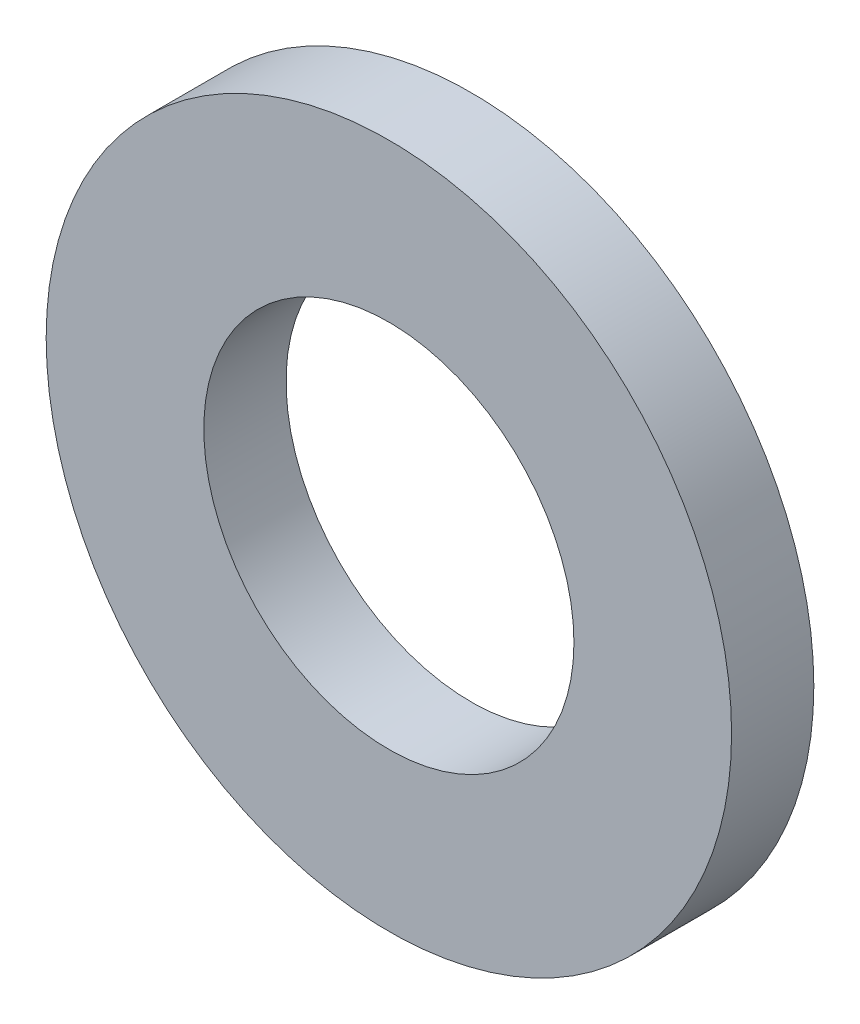
ISO-10303-21;
HEADER;
FILE_DESCRIPTION(('STEP AP214'),'2;1');
FILE_NAME('part.step','',(''),(''),'','','');
FILE_SCHEMA(('AUTOMOTIVE_DESIGN { 1 0 10303 214 1 1 1 1 }'));
ENDSEC;
DATA;
#1=APPLICATION_CONTEXT('core data for automotive mechanical design processes');
#2=APPLICATION_PROTOCOL_DEFINITION('international standard','automotive_design',2000,#1);
#3=PRODUCT_CONTEXT('',#1,'mechanical');
#4=PRODUCT('Part','Part','',(#3));
#5=PRODUCT_RELATED_PRODUCT_CATEGORY('part','',(#4));
#6=PRODUCT_DEFINITION_FORMATION('','',#4);
#7=PRODUCT_DEFINITION_CONTEXT('part definition',#1,'design');
#8=PRODUCT_DEFINITION('design','',#6,#7);
#9=PRODUCT_DEFINITION_SHAPE('','',#8);
#10=(LENGTH_UNIT() NAMED_UNIT(*) SI_UNIT(.MILLI.,.METRE.));
#11=(NAMED_UNIT(*) PLANE_ANGLE_UNIT() SI_UNIT($,.RADIAN.));
#12=(NAMED_UNIT(*) SI_UNIT($,.STERADIAN.) SOLID_ANGLE_UNIT());
#13=UNCERTAINTY_MEASURE_WITH_UNIT(LENGTH_MEASURE(1.E-05),#10,'distance_accuracy_value','');
#14=(GEOMETRIC_REPRESENTATION_CONTEXT(3) GLOBAL_UNCERTAINTY_ASSIGNED_CONTEXT((#13)) GLOBAL_UNIT_ASSIGNED_CONTEXT((#10,
#11,#12)) REPRESENTATION_CONTEXT('',''));
#15=CARTESIAN_POINT('',(0.,0.,0.));
#16=DIRECTION('',(0.,0.,1.));
#17=DIRECTION('',(1.,0.,0.));
#18=AXIS2_PLACEMENT_3D('',#15,#16,#17);
#19=CARTESIAN_POINT('',(0.,0.,0.6));
#20=DIRECTION('',(0.,0.,1.));
#21=DIRECTION('',(1.,0.,0.));
#22=AXIS2_PLACEMENT_3D('',#19,#20,#21);
#23=PLANE('',#22);
#24=CARTESIAN_POINT('',(0.,0.,0.6));
#25=DIRECTION('',(0.,0.,1.));
#26=DIRECTION('',(1.,0.,0.));
#27=AXIS2_PLACEMENT_3D('',#24,#25,#26);
#28=CIRCLE('',#27,2.5);
#29=CARTESIAN_POINT('',(2.5,0.,0.6));
#30=VERTEX_POINT('',#29);
#31=EDGE_CURVE('E10',#30,#30,#28,.T.);
#32=ORIENTED_EDGE('',*,*,#31,.T.);
#33=EDGE_LOOP('',(#32));
#34=FACE_BOUND('',#33,.T.);
#35=CARTESIAN_POINT('',(0.,0.,0.6));
#36=DIRECTION('',(0.,0.,1.));
#37=DIRECTION('',(1.,0.,0.));
#38=AXIS2_PLACEMENT_3D('',#35,#36,#37);
#39=CIRCLE('',#38,1.35);
#40=CARTESIAN_POINT('',(1.35,0.,0.6));
#41=VERTEX_POINT('',#40);
#42=EDGE_CURVE('E41',#41,#41,#39,.T.);
#43=ORIENTED_EDGE('',*,*,#42,.F.);
#44=EDGE_LOOP('',(#43));
#45=FACE_BOUND('',#44,.T.);
#46=ADVANCED_FACE('F30',(#34,#45),#23,.T.);
#47=CARTESIAN_POINT('',(0.,0.,0.));
#48=DIRECTION('',(0.,0.,1.));
#49=DIRECTION('',(1.,0.,0.));
#50=AXIS2_PLACEMENT_3D('',#47,#48,#49);
#51=PLANE('',#50);
#52=CARTESIAN_POINT('',(0.,0.,0.));
#53=DIRECTION('',(0.,0.,1.));
#54=DIRECTION('',(1.,0.,0.));
#55=AXIS2_PLACEMENT_3D('',#52,#53,#54);
#56=CIRCLE('',#55,2.5);
#57=CARTESIAN_POINT('',(2.5,0.,0.));
#58=VERTEX_POINT('',#57);
#59=EDGE_CURVE('E34',#58,#58,#56,.T.);
#60=ORIENTED_EDGE('',*,*,#59,.F.);
#61=EDGE_LOOP('',(#60));
#62=FACE_BOUND('',#61,.T.);
#63=CARTESIAN_POINT('',(0.,0.,0.));
#64=DIRECTION('',(0.,0.,1.));
#65=DIRECTION('',(1.,0.,0.));
#66=AXIS2_PLACEMENT_3D('',#63,#64,#65);
#67=CIRCLE('',#66,1.35);
#68=CARTESIAN_POINT('',(1.35,0.,0.));
#69=VERTEX_POINT('',#68);
#70=EDGE_CURVE('E43',#69,#69,#67,.T.);
#71=ORIENTED_EDGE('',*,*,#70,.T.);
#72=EDGE_LOOP('',(#71));
#73=FACE_BOUND('',#72,.T.);
#74=ADVANCED_FACE('F53',(#62,#73),#51,.F.);
#75=CARTESIAN_POINT('',(0.,0.,0.6));
#76=DIRECTION('',(0.,0.,-1.));
#77=DIRECTION('',(-1.,0.,0.));
#78=AXIS2_PLACEMENT_3D('',#75,#76,#77);
#79=CYLINDRICAL_SURFACE('',#78,2.5);
#80=ORIENTED_EDGE('',*,*,#31,.F.);
#81=EDGE_LOOP('',(#80));
#82=FACE_BOUND('',#81,.T.);
#83=ORIENTED_EDGE('',*,*,#59,.T.);
#84=EDGE_LOOP('',(#83));
#85=FACE_BOUND('',#84,.T.);
#86=ADVANCED_FACE('F32',(#82,#85),#79,.T.);
#87=CARTESIAN_POINT('',(0.,0.,0.6));
#88=DIRECTION('',(0.,0.,-1.));
#89=DIRECTION('',(-1.,0.,0.));
#90=AXIS2_PLACEMENT_3D('',#87,#88,#89);
#91=CYLINDRICAL_SURFACE('',#90,1.35);
#92=ORIENTED_EDGE('',*,*,#42,.T.);
#93=EDGE_LOOP('',(#92));
#94=FACE_BOUND('',#93,.T.);
#95=ORIENTED_EDGE('',*,*,#70,.F.);
#96=EDGE_LOOP('',(#95));
#97=FACE_BOUND('',#96,.T.);
#98=ADVANCED_FACE('F49',(#94,#97),#91,.F.);
#99=CLOSED_SHELL('',(#46,#74,#86,#98));
#100=MANIFOLD_SOLID_BREP('B2',#99);
#101=ADVANCED_BREP_SHAPE_REPRESENTATION('',(#18,#100),#14);
#102=SHAPE_DEFINITION_REPRESENTATION(#9,#101);
ENDSEC;
END-ISO-10303-21;
